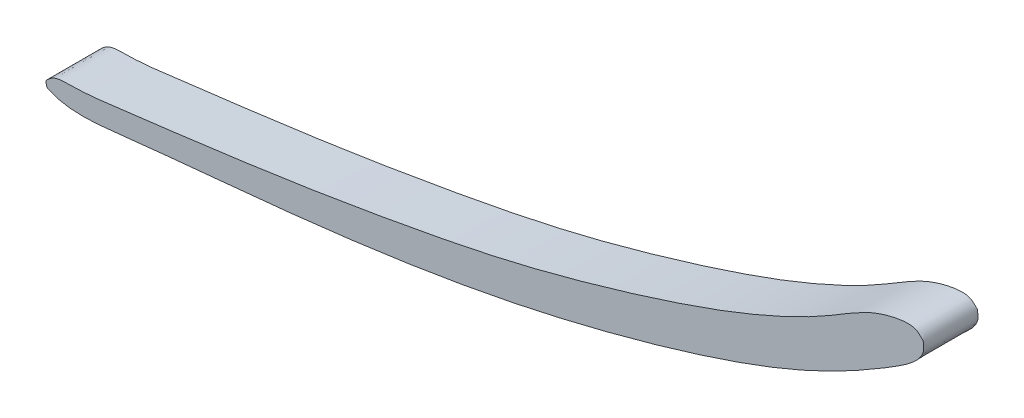
ISO-10303-21;
HEADER;
FILE_DESCRIPTION(('STEP AP214'),'2;1');
FILE_NAME('part.step','',(''),(''),'','','');
FILE_SCHEMA(('AUTOMOTIVE_DESIGN { 1 0 10303 214 1 1 1 1 }'));
ENDSEC;
DATA;
#1=APPLICATION_CONTEXT('core data for automotive mechanical design processes');
#2=APPLICATION_PROTOCOL_DEFINITION('international standard','automotive_design',2000,#1);
#3=PRODUCT_CONTEXT('',#1,'mechanical');
#4=PRODUCT('Part','Part','',(#3));
#5=PRODUCT_RELATED_PRODUCT_CATEGORY('part','',(#4));
#6=PRODUCT_DEFINITION_FORMATION('','',#4);
#7=PRODUCT_DEFINITION_CONTEXT('part definition',#1,'design');
#8=PRODUCT_DEFINITION('design','',#6,#7);
#9=PRODUCT_DEFINITION_SHAPE('','',#8);
#10=(LENGTH_UNIT() NAMED_UNIT(*) SI_UNIT(.MILLI.,.METRE.));
#11=(NAMED_UNIT(*) PLANE_ANGLE_UNIT() SI_UNIT($,.RADIAN.));
#12=(NAMED_UNIT(*) SI_UNIT($,.STERADIAN.) SOLID_ANGLE_UNIT());
#13=UNCERTAINTY_MEASURE_WITH_UNIT(LENGTH_MEASURE(1.E-05),#10,'distance_accuracy_value','');
#14=(GEOMETRIC_REPRESENTATION_CONTEXT(3) GLOBAL_UNCERTAINTY_ASSIGNED_CONTEXT((#13)) GLOBAL_UNIT_ASSIGNED_CONTEXT((#10,
#11,#12)) REPRESENTATION_CONTEXT('',''));
#15=CARTESIAN_POINT('',(0.,0.,0.));
#16=DIRECTION('',(0.,0.,1.));
#17=DIRECTION('',(1.,0.,0.));
#18=AXIS2_PLACEMENT_3D('',#15,#16,#17);
#19=CARTESIAN_POINT('',(77.0471824251004,0.,340.));
#20=CARTESIAN_POINT('',(77.0146555322056,0.0863166586013353,340.));
#21=CARTESIAN_POINT('',(76.9524964480641,0.154335533494201,340.));
#22=CARTESIAN_POINT('',(76.8237230305714,0.282837010887133,340.));
#23=CARTESIAN_POINT('',(76.7556264445835,0.343122665332197,340.));
#24=CARTESIAN_POINT('',(76.5553728382018,0.528293432071832,340.));
#25=CARTESIAN_POINT('',(76.4220917559369,0.653592764606201,340.));
#26=CARTESIAN_POINT('',(76.2043074000419,0.814460488594797,340.));
#27=CARTESIAN_POINT('',(76.1290725258105,0.86382796948944,340.));
#28=CARTESIAN_POINT('',(75.96939127876,0.94771654116557,340.));
#29=CARTESIAN_POINT('',(75.8844994922596,0.983024516410986,340.));
#30=CARTESIAN_POINT('',(75.6246037444075,1.06898672410137,340.));
#31=CARTESIAN_POINT('',(75.4466999622953,1.10009486170765,340.));
#32=CARTESIAN_POINT('',(75.0864322881535,1.13712662451366,340.));
#33=CARTESIAN_POINT('',(74.9037374390867,1.14218857214666,340.));
#34=CARTESIAN_POINT('',(74.5424142232882,1.13912913551873,340.));
#35=CARTESIAN_POINT('',(74.3626582437369,1.1303364467,340.));
#36=CARTESIAN_POINT('',(73.8257883448107,1.08472654872135,340.));
#37=CARTESIAN_POINT('',(73.4708334291705,1.03059453213553,340.));
#38=CARTESIAN_POINT('',(72.7637995287449,0.899266069698866,340.));
#39=CARTESIAN_POINT('',(72.4109138075771,0.820139550652951,340.));
#40=CARTESIAN_POINT('',(71.7133401259366,0.640473894826015,340.));
#41=CARTESIAN_POINT('',(71.3689605037362,0.540512570028266,340.));
#42=CARTESIAN_POINT('',(70.3483277394546,0.211887562048509,340.));
#43=CARTESIAN_POINT('',(69.6851033159787,-0.0467182109595835,340.));
#44=CARTESIAN_POINT('',(67.7447185778583,-0.935808500752684,340.));
#45=CARTESIAN_POINT('',(66.5113431371267,-1.6680403111967,340.));
#46=CARTESIAN_POINT('',(64.0536214073227,-3.14717577345884,340.));
#47=CARTESIAN_POINT('',(62.8234225107314,-3.88414230181726,340.));
#48=CARTESIAN_POINT('',(60.3142384271617,-5.26323228804384,340.));
#49=CARTESIAN_POINT('',(59.0379593899145,-5.91061664088238,340.));
#50=CARTESIAN_POINT('',(56.457464889384,-7.1510754901888,340.));
#51=CARTESIAN_POINT('',(55.1531990656894,-7.74405208341363,340.));
#52=CARTESIAN_POINT('',(52.5233662364128,-8.88859467112276,340.));
#53=CARTESIAN_POINT('',(51.1973467497779,-9.43830430356624,340.));
#54=CARTESIAN_POINT('',(48.530657853182,-10.4919328429382,340.));
#55=CARTESIAN_POINT('',(47.1894193599274,-10.9971700086824,340.));
#56=CARTESIAN_POINT('',(43.1474834055716,-12.4630787652045,340.));
#57=CARTESIAN_POINT('',(40.4288084726874,-13.3758096283422,340.));
#58=CARTESIAN_POINT('',(34.9654885667954,-15.1250049640294,340.));
#59=CARTESIAN_POINT('',(32.2199888554053,-15.9563645046367,340.));
#60=CARTESIAN_POINT('',(26.7093937571909,-17.5481608100868,340.));
#61=CARTESIAN_POINT('',(23.9445746865587,-18.3085100052458,340.));
#62=CARTESIAN_POINT('',(18.3882260762704,-19.7294838581142,340.));
#63=CARTESIAN_POINT('',(15.5957280661058,-20.3893578811587,340.));
#64=CARTESIAN_POINT('',(9.99129559669953,-21.6080539721866,340.));
#65=CARTESIAN_POINT('',(7.17927046386732,-22.1699851603401,340.));
#66=CARTESIAN_POINT('',(1.54356475054083,-23.2375043376461,340.));
#67=CARTESIAN_POINT('',(-1.2796953431305,-23.7442216498729,340.));
#68=CARTESIAN_POINT('',(-6.93171871570946,-24.7219311757435,340.));
#69=CARTESIAN_POINT('',(-9.76097830039444,-25.191796424645,340.));
#70=CARTESIAN_POINT('',(-15.4279124031103,-26.0822946924952,340.));
#71=CARTESIAN_POINT('',(-18.265080685828,-26.5016793423909,340.));
#72=CARTESIAN_POINT('',(-23.945273229535,-27.2995266241375,340.));
#73=CARTESIAN_POINT('',(-26.7882025273632,-27.6789489674857,340.));
#74=CARTESIAN_POINT('',(-32.4765710658541,-28.4186804039392,340.));
#75=CARTESIAN_POINT('',(-35.3215683118665,-28.78231857797,340.));
#76=CARTESIAN_POINT('',(-39.5900884189641,-29.3196074259457,340.));
#77=CARTESIAN_POINT('',(-41.0133511400201,-29.495315036399,340.));
#78=CARTESIAN_POINT('',(-43.8608217500198,-29.838968634286,340.));
#79=CARTESIAN_POINT('',(-45.285002612444,-30.0190210079599,340.));
#80=CARTESIAN_POINT('',(-47.0746167465888,-30.1217813882314,340.));
#81=CARTESIAN_POINT('',(-47.4327564283644,-30.1369148293064,340.));
#82=CARTESIAN_POINT('',(-48.1495646836194,-30.1539660983092,340.));
#83=CARTESIAN_POINT('',(-48.5083094982918,-30.1539788592691,340.));
#84=CARTESIAN_POINT('',(-49.2252625076823,-30.1674131030013,340.));
#85=CARTESIAN_POINT('',(-49.5840358391826,-30.1814765658246,340.));
#86=CARTESIAN_POINT('',(-50.2971441110804,-30.2572576264925,340.));
#87=CARTESIAN_POINT('',(-50.6490127319915,-30.3172343289797,340.));
#88=CARTESIAN_POINT('',(-51.1542180914164,-30.5137178465537,340.));
#89=CARTESIAN_POINT('',(-51.3113826366352,-30.5978341956615,340.));
#90=CARTESIAN_POINT('',(-51.6076182423445,-30.7919691396183,340.));
#91=CARTESIAN_POINT('',(-51.7463449054835,-30.9032799814332,340.));
#92=CARTESIAN_POINT('',(-51.9531584541602,-31.0721822065051,340.));
#93=CARTESIAN_POINT('',(-52.022182470908,-31.1292090866995,340.));
#94=CARTESIAN_POINT('',(-52.1487733284143,-31.2547196672732,340.));
#95=CARTESIAN_POINT('',(-52.2067031299198,-31.3266225564946,340.));
#96=CARTESIAN_POINT('',(-52.2568427549299,-31.4987475585804,340.));
#97=CARTESIAN_POINT('',(-52.2519652975137,-31.5901243448903,340.));
#98=CARTESIAN_POINT('',(-52.225836321639,-31.7648290498639,340.));
#99=CARTESIAN_POINT('',(-52.2064552932178,-31.8510930105967,340.));
#100=CARTESIAN_POINT('',(-52.1565899063423,-32.0217077371924,340.));
#101=CARTESIAN_POINT('',(-52.1249198310784,-32.1067611570869,340.));
#102=CARTESIAN_POINT('',(-52.0451983343292,-32.2123002935991,340.));
#103=CARTESIAN_POINT('',(-52.0131853247661,-32.244160940725,340.));
#104=CARTESIAN_POINT('',(-51.9414556778389,-32.2956635428167,340.));
#105=CARTESIAN_POINT('',(-51.9016471867821,-32.3155451361235,340.));
#106=CARTESIAN_POINT('',(-51.7783230470125,-32.3659175753124,340.));
#107=CARTESIAN_POINT('',(-51.6923979877279,-32.3884557118565,340.));
#108=CARTESIAN_POINT('',(-51.5231673904825,-32.4413316400593,340.));
#109=CARTESIAN_POINT('',(-51.4389528037406,-32.4689627284318,340.));
#110=CARTESIAN_POINT('',(-51.1879203450189,-32.5566536624601,340.));
#111=CARTESIAN_POINT('',(-51.0222339862843,-32.620865695218,340.));
#112=CARTESIAN_POINT('',(-50.6885784845226,-32.7407261607042,340.));
#113=CARTESIAN_POINT('',(-50.5205915138849,-32.79572561507,340.));
#114=CARTESIAN_POINT('',(-50.0106690590748,-32.9353663644461,340.));
#115=CARTESIAN_POINT('',(-49.6643869796551,-33.0015192773072,340.));
#116=CARTESIAN_POINT('',(-48.9652965778557,-33.1060655194977,340.));
#117=CARTESIAN_POINT('',(-48.6116792270687,-33.1454182767843,340.));
#118=CARTESIAN_POINT('',(-47.5546619711886,-33.2292997928266,340.));
#119=CARTESIAN_POINT('',(-46.8524943366603,-33.237922858829,340.));
#120=CARTESIAN_POINT('',(-45.4512826023249,-33.1963222867672,340.));
#121=CARTESIAN_POINT('',(-44.7521151770398,-33.1484220734604,340.));
#122=CARTESIAN_POINT('',(-43.3549261760107,-33.0310340946454,340.));
#123=CARTESIAN_POINT('',(-42.6569807078951,-32.9601124782319,340.));
#124=CARTESIAN_POINT('',(-40.5636218693402,-32.7383503949779,340.));
#125=CARTESIAN_POINT('',(-39.1687931225503,-32.5779330235232,340.));
#126=CARTESIAN_POINT('',(-36.3777584826631,-32.2738299813763,340.));
#127=CARTESIAN_POINT('',(-34.9815949952765,-32.1279594765328,340.));
#128=CARTESIAN_POINT('',(-30.7912858318226,-31.7077450350649,340.));
#129=CARTESIAN_POINT('',(-27.9958980075123,-31.4454823578545,340.));
#130=CARTESIAN_POINT('',(-22.4064884392869,-30.9077600312406,340.));
#131=CARTESIAN_POINT('',(-19.6125873324476,-30.6308927493038,340.));
#132=CARTESIAN_POINT('',(-14.0290194129763,-30.0349767490959,340.));
#133=CARTESIAN_POINT('',(-11.2392841390066,-29.7163798832265,340.));
#134=CARTESIAN_POINT('',(-5.66799810320546,-29.0211226705023,340.));
#135=CARTESIAN_POINT('',(-2.88617590834408,-28.64476183975,340.));
#136=CARTESIAN_POINT('',(5.44635399415661,-27.4183967335943,340.));
#137=CARTESIAN_POINT('',(10.9811645024912,-26.4664397070159,340.));
#138=CARTESIAN_POINT('',(19.2328397543524,-24.7834161335269,340.));
#139=CARTESIAN_POINT('',(21.975743131188,-24.1787582693961,340.));
#140=CARTESIAN_POINT('',(27.4391633385939,-22.8868987305506,340.));
#141=CARTESIAN_POINT('',(30.1605525025149,-22.1998604441367,340.));
#142=CARTESIAN_POINT('',(35.5840563575425,-20.7490132467417,340.));
#143=CARTESIAN_POINT('',(38.2864671245927,-19.9831264422487,340.));
#144=CARTESIAN_POINT('',(43.661690378912,-18.3649653233764,340.));
#145=CARTESIAN_POINT('',(46.3353036288615,-17.5128570425006,340.));
#146=CARTESIAN_POINT('',(51.6407805561876,-15.6803121072609,340.));
#147=CARTESIAN_POINT('',(54.2750173140796,-14.6987147480214,340.));
#148=CARTESIAN_POINT('',(59.4612276986311,-12.546674316923,340.));
#149=CARTESIAN_POINT('',(62.0162582767699,-11.3736221972291,340.));
#150=CARTESIAN_POINT('',(67.013837923782,-8.80951193411212,340.));
#151=CARTESIAN_POINT('',(69.4583616925774,-7.41981567579946,340.));
#152=CARTESIAN_POINT('',(72.4510876879843,-5.58224403511159,340.));
#153=CARTESIAN_POINT('',(73.0467075306561,-5.20967054019417,340.));
#154=CARTESIAN_POINT('',(73.9266370823077,-4.63027731878672,340.));
#155=CARTESIAN_POINT('',(74.2170880788137,-4.43304809487779,340.));
#156=CARTESIAN_POINT('',(74.7885298643328,-4.02502849642455,340.));
#157=CARTESIAN_POINT('',(75.070618625478,-3.81430838622695,340.));
#158=CARTESIAN_POINT('',(75.6114595386623,-3.36925027527479,340.));
#159=CARTESIAN_POINT('',(75.8704060250538,-3.1350594885547,340.));
#160=CARTESIAN_POINT('',(76.2296746466436,-2.75414516921807,340.));
#161=CARTESIAN_POINT('',(76.3444437070808,-2.62210497257768,340.));
#162=CARTESIAN_POINT('',(76.5605512403057,-2.34437421234657,340.));
#163=CARTESIAN_POINT('',(76.6619184754367,-2.19816225725901,340.));
#164=CARTESIAN_POINT('',(76.8447587316167,-1.89656094146917,340.));
#165=CARTESIAN_POINT('',(76.9268574595057,-1.74021782568998,340.));
#166=CARTESIAN_POINT('',(77.0573933826859,-1.40982604823507,340.));
#167=CARTESIAN_POINT('',(77.1047913583254,-1.24064638179016,340.));
#168=CARTESIAN_POINT('',(77.1348953502386,-0.887865191662483,340.));
#169=CARTESIAN_POINT('',(77.1147362753775,-0.708538757578463,340.));
#170=CARTESIAN_POINT('',(77.0900031531362,-0.442788745670691,340.));
#171=CARTESIAN_POINT('',(77.0857480509515,-0.353886186285419,340.));
#172=CARTESIAN_POINT('',(77.0790792907043,-0.175933714904456,340.));
#173=CARTESIAN_POINT('',(77.0797093179952,-0.08631665860132,340.));
#174=CARTESIAN_POINT('',(77.0471824251004,0.,340.));
#175=B_SPLINE_CURVE_WITH_KNOTS('',3,(#19,#20,#21,#22,#23,#24,#25,#26,#27,#28,#29,#30,#31,#32,
#33,#34,#35,#36,#37,#38,#39,#40,#41,#42,#43,#44,#45,#46,#47,#48,#49,#50,#51,#52,#53,#54,#55,#56,
#57,#58,#59,#60,#61,#62,#63,#64,#65,#66,#67,#68,#69,#70,#71,#72,#73,#74,#75,#76,#77,#78,#79,#80,
#81,#82,#83,#84,#85,#86,#87,#88,#89,#90,#91,#92,#93,#94,#95,#96,#97,#98,#99,#100,#101,#102,#103,
#104,#105,#106,#107,#108,#109,#110,#111,#112,#113,#114,#115,#116,#117,#118,#119,#120,#121,#122,
#123,#124,#125,#126,#127,#128,#129,#130,#131,#132,#133,#134,#135,#136,#137,#138,#139,#140,#141,
#142,#143,#144,#145,#146,#147,#148,#149,#150,#151,#152,#153,#154,#155,#156,#157,#158,#159,#160,
#161,#162,#163,#164,#165,#166,#167,#168,#169,#170,#171,#172,#173,#174),.UNSPECIFIED.,.T.,.F.,(4,
2,2,2,2,2,2,2,2,2,2,2,2,2,2,2,2,2,2,2,2,2,2,2,2,2,2,2,2,2,2,2,2,2,2,2,2,2,2,2,2,2,2,2,2,2,2,2,2,
2,2,2,2,2,2,2,2,2,2,2,2,2,2,2,2,2,2,2,2,2,2,2,2,2,2,2,2,4),(0.,0.000976562499999935,
0.00195312499999987,0.00390624999999985,0.00488281249999984,0.00585937499999983,
0.00781249999999981,0.00976562499999978,0.0117187499999998,0.0156249999999997,
0.0195312499999997,0.0234374999999996,0.0312499999999995,0.0468749999999992,0.0624999999999989,
0.0781249999999986,0.0937499999999983,0.109374999999998,0.124999999999998,0.156249999999997,
0.187499999999996,0.218749999999996,0.249999999999995,0.281249999999995,0.312499999999994,
0.343749999999993,0.374999999999993,0.406249999999992,0.437499999999991,0.453124999999991,
0.468749999999991,0.472656249999991,0.476562499999991,0.48046874999999,0.48437499999999,
0.48632812499999,0.48828124999999,0.48925781249999,0.49023437499999,0.49121093749999,
0.49218749999999,0.49316406249999,0.49365234374999,0.49414062499999,0.49511718749999,
0.49609374999999,0.49804687499999,0.49999999999999,0.50390624999999,0.50781249999999,
0.515624999999991,0.523437499999991,0.531249999999991,0.546874999999991,0.562499999999992,
0.593749999999992,0.624999999999993,0.656249999999993,0.687499999999994,0.749999999999995,
0.781249999999996,0.812499999999996,0.843749999999997,0.874999999999997,0.906249999999998,
0.937499999999999,0.968749999999999,0.976562499999999,0.980468749999999,0.984374999999999,
0.988281249999999,0.990234375,0.9921875,0.994140625,0.99609375,0.998046875,0.9990234375,1.),.UNSPECIFIED.);
#176=DIRECTION('',(0.,0.,-1.));
#177=VECTOR('',#176,1.);
#178=SURFACE_OF_LINEAR_EXTRUSION('',#175,#177);
#179=CARTESIAN_POINT('',(77.0471824251004,0.,340.));
#180=CARTESIAN_POINT('',(77.0797093179952,-0.08631665860132,340.));
#181=CARTESIAN_POINT('',(77.0790792907043,-0.175933714904456,340.));
#182=CARTESIAN_POINT('',(77.0857480509515,-0.353886186285419,340.));
#183=CARTESIAN_POINT('',(77.0900031531362,-0.442788745670691,340.));
#184=CARTESIAN_POINT('',(77.1147362753775,-0.708538757578463,340.));
#185=CARTESIAN_POINT('',(77.1348953502386,-0.887865191662483,340.));
#186=CARTESIAN_POINT('',(77.1047913583254,-1.24064638179016,340.));
#187=CARTESIAN_POINT('',(77.0573933826859,-1.40982604823507,340.));
#188=CARTESIAN_POINT('',(76.9268574595057,-1.74021782568998,340.));
#189=CARTESIAN_POINT('',(76.8447587316167,-1.89656094146917,340.));
#190=CARTESIAN_POINT('',(76.6619184754367,-2.19816225725901,340.));
#191=CARTESIAN_POINT('',(76.5605512403057,-2.34437421234657,340.));
#192=CARTESIAN_POINT('',(76.3444437070808,-2.62210497257768,340.));
#193=CARTESIAN_POINT('',(76.2296746466436,-2.75414516921807,340.));
#194=CARTESIAN_POINT('',(75.8704060250538,-3.1350594885547,340.));
#195=CARTESIAN_POINT('',(75.6114595386623,-3.36925027527479,340.));
#196=CARTESIAN_POINT('',(75.070618625478,-3.81430838622695,340.));
#197=CARTESIAN_POINT('',(74.7885298643328,-4.02502849642455,340.));
#198=CARTESIAN_POINT('',(74.2170880788137,-4.43304809487779,340.));
#199=CARTESIAN_POINT('',(73.9266370823077,-4.63027731878672,340.));
#200=CARTESIAN_POINT('',(73.0467075306561,-5.20967054019417,340.));
#201=CARTESIAN_POINT('',(72.4510876879843,-5.58224403511159,340.));
#202=CARTESIAN_POINT('',(69.4583616925774,-7.41981567579946,340.));
#203=CARTESIAN_POINT('',(67.013837923782,-8.80951193411212,340.));
#204=CARTESIAN_POINT('',(62.0162582767699,-11.3736221972291,340.));
#205=CARTESIAN_POINT('',(59.4612276986311,-12.546674316923,340.));
#206=CARTESIAN_POINT('',(54.2750173140796,-14.6987147480214,340.));
#207=CARTESIAN_POINT('',(51.6407805561876,-15.6803121072609,340.));
#208=CARTESIAN_POINT('',(46.3353036288615,-17.5128570425006,340.));
#209=CARTESIAN_POINT('',(43.661690378912,-18.3649653233764,340.));
#210=CARTESIAN_POINT('',(38.2864671245927,-19.9831264422487,340.));
#211=CARTESIAN_POINT('',(35.5840563575425,-20.7490132467417,340.));
#212=CARTESIAN_POINT('',(30.1605525025149,-22.1998604441367,340.));
#213=CARTESIAN_POINT('',(27.4391633385939,-22.8868987305506,340.));
#214=CARTESIAN_POINT('',(21.975743131188,-24.1787582693961,340.));
#215=CARTESIAN_POINT('',(19.2328397543524,-24.7834161335269,340.));
#216=CARTESIAN_POINT('',(10.9811645024912,-26.4664397070159,340.));
#217=CARTESIAN_POINT('',(5.44635399415661,-27.4183967335943,340.));
#218=CARTESIAN_POINT('',(-2.88617590834408,-28.64476183975,340.));
#219=CARTESIAN_POINT('',(-5.66799810320546,-29.0211226705023,340.));
#220=CARTESIAN_POINT('',(-11.2392841390066,-29.7163798832265,340.));
#221=CARTESIAN_POINT('',(-14.0290194129763,-30.0349767490959,340.));
#222=CARTESIAN_POINT('',(-19.6125873324476,-30.6308927493038,340.));
#223=CARTESIAN_POINT('',(-22.4064884392869,-30.9077600312406,340.));
#224=CARTESIAN_POINT('',(-27.9958980075123,-31.4454823578545,340.));
#225=CARTESIAN_POINT('',(-30.7912858318226,-31.7077450350649,340.));
#226=CARTESIAN_POINT('',(-34.9815949952765,-32.1279594765328,340.));
#227=CARTESIAN_POINT('',(-36.3777584826631,-32.2738299813763,340.));
#228=CARTESIAN_POINT('',(-39.1687931225503,-32.5779330235232,340.));
#229=CARTESIAN_POINT('',(-40.5636218693402,-32.7383503949779,340.));
#230=CARTESIAN_POINT('',(-42.6569807078951,-32.9601124782319,340.));
#231=CARTESIAN_POINT('',(-43.3549261760107,-33.0310340946454,340.));
#232=CARTESIAN_POINT('',(-44.7521151770398,-33.1484220734604,340.));
#233=CARTESIAN_POINT('',(-45.4512826023249,-33.1963222867672,340.));
#234=CARTESIAN_POINT('',(-46.8524943366603,-33.237922858829,340.));
#235=CARTESIAN_POINT('',(-47.5546619711886,-33.2292997928266,340.));
#236=CARTESIAN_POINT('',(-48.6116792270687,-33.1454182767843,340.));
#237=CARTESIAN_POINT('',(-48.9652965778557,-33.1060655194977,340.));
#238=CARTESIAN_POINT('',(-49.6643869796551,-33.0015192773072,340.));
#239=CARTESIAN_POINT('',(-50.0106690590748,-32.9353663644461,340.));
#240=CARTESIAN_POINT('',(-50.5205915138849,-32.79572561507,340.));
#241=CARTESIAN_POINT('',(-50.6885784845226,-32.7407261607042,340.));
#242=CARTESIAN_POINT('',(-51.0222339862843,-32.620865695218,340.));
#243=CARTESIAN_POINT('',(-51.1879203450189,-32.5566536624601,340.));
#244=CARTESIAN_POINT('',(-51.4389528037406,-32.4689627284318,340.));
#245=CARTESIAN_POINT('',(-51.5231673904825,-32.4413316400593,340.));
#246=CARTESIAN_POINT('',(-51.6923979877279,-32.3884557118565,340.));
#247=CARTESIAN_POINT('',(-51.7783230470125,-32.3659175753124,340.));
#248=CARTESIAN_POINT('',(-51.9016471867821,-32.3155451361235,340.));
#249=CARTESIAN_POINT('',(-51.9414556778389,-32.2956635428167,340.));
#250=CARTESIAN_POINT('',(-52.0131853247661,-32.244160940725,340.));
#251=CARTESIAN_POINT('',(-52.0451983343292,-32.2123002935991,340.));
#252=CARTESIAN_POINT('',(-52.1249198310784,-32.1067611570869,340.));
#253=CARTESIAN_POINT('',(-52.1565899063423,-32.0217077371924,340.));
#254=CARTESIAN_POINT('',(-52.2064552932178,-31.8510930105967,340.));
#255=CARTESIAN_POINT('',(-52.225836321639,-31.7648290498639,340.));
#256=CARTESIAN_POINT('',(-52.2519652975137,-31.5901243448903,340.));
#257=CARTESIAN_POINT('',(-52.2568427549299,-31.4987475585804,340.));
#258=CARTESIAN_POINT('',(-52.2067031299198,-31.3266225564946,340.));
#259=CARTESIAN_POINT('',(-52.1487733284143,-31.2547196672732,340.));
#260=CARTESIAN_POINT('',(-52.022182470908,-31.1292090866995,340.));
#261=CARTESIAN_POINT('',(-51.9531584541602,-31.0721822065051,340.));
#262=CARTESIAN_POINT('',(-51.7463449054835,-30.9032799814332,340.));
#263=CARTESIAN_POINT('',(-51.6076182423445,-30.7919691396183,340.));
#264=CARTESIAN_POINT('',(-51.3113826366352,-30.5978341956615,340.));
#265=CARTESIAN_POINT('',(-51.1542180914164,-30.5137178465537,340.));
#266=CARTESIAN_POINT('',(-50.6490127319915,-30.3172343289797,340.));
#267=CARTESIAN_POINT('',(-50.2971441110804,-30.2572576264925,340.));
#268=CARTESIAN_POINT('',(-49.5840358391826,-30.1814765658246,340.));
#269=CARTESIAN_POINT('',(-49.2252625076823,-30.1674131030013,340.));
#270=CARTESIAN_POINT('',(-48.5083094982918,-30.1539788592691,340.));
#271=CARTESIAN_POINT('',(-48.1495646836194,-30.1539660983092,340.));
#272=CARTESIAN_POINT('',(-47.4327564283644,-30.1369148293064,340.));
#273=CARTESIAN_POINT('',(-47.0746167465888,-30.1217813882314,340.));
#274=CARTESIAN_POINT('',(-45.285002612444,-30.0190210079599,340.));
#275=CARTESIAN_POINT('',(-43.8608217500198,-29.838968634286,340.));
#276=CARTESIAN_POINT('',(-41.0133511400201,-29.495315036399,340.));
#277=CARTESIAN_POINT('',(-39.5900884189641,-29.3196074259457,340.));
#278=CARTESIAN_POINT('',(-35.3215683118665,-28.78231857797,340.));
#279=CARTESIAN_POINT('',(-32.4765710658541,-28.4186804039392,340.));
#280=CARTESIAN_POINT('',(-26.7882025273632,-27.6789489674857,340.));
#281=CARTESIAN_POINT('',(-23.945273229535,-27.2995266241375,340.));
#282=CARTESIAN_POINT('',(-18.265080685828,-26.5016793423909,340.));
#283=CARTESIAN_POINT('',(-15.4279124031103,-26.0822946924952,340.));
#284=CARTESIAN_POINT('',(-9.76097830039444,-25.191796424645,340.));
#285=CARTESIAN_POINT('',(-6.93171871570946,-24.7219311757435,340.));
#286=CARTESIAN_POINT('',(-1.2796953431305,-23.7442216498729,340.));
#287=CARTESIAN_POINT('',(1.54356475054083,-23.2375043376461,340.));
#288=CARTESIAN_POINT('',(7.17927046386732,-22.1699851603401,340.));
#289=CARTESIAN_POINT('',(9.99129559669953,-21.6080539721866,340.));
#290=CARTESIAN_POINT('',(15.5957280661058,-20.3893578811587,340.));
#291=CARTESIAN_POINT('',(18.3882260762704,-19.7294838581142,340.));
#292=CARTESIAN_POINT('',(23.9445746865587,-18.3085100052458,340.));
#293=CARTESIAN_POINT('',(26.7093937571909,-17.5481608100868,340.));
#294=CARTESIAN_POINT('',(32.2199888554053,-15.9563645046367,340.));
#295=CARTESIAN_POINT('',(34.9654885667954,-15.1250049640294,340.));
#296=CARTESIAN_POINT('',(40.4288084726874,-13.3758096283422,340.));
#297=CARTESIAN_POINT('',(43.1474834055716,-12.4630787652045,340.));
#298=CARTESIAN_POINT('',(47.1894193599274,-10.9971700086824,340.));
#299=CARTESIAN_POINT('',(48.530657853182,-10.4919328429382,340.));
#300=CARTESIAN_POINT('',(51.1973467497779,-9.43830430356624,340.));
#301=CARTESIAN_POINT('',(52.5233662364128,-8.88859467112276,340.));
#302=CARTESIAN_POINT('',(55.1531990656894,-7.74405208341363,340.));
#303=CARTESIAN_POINT('',(56.457464889384,-7.1510754901888,340.));
#304=CARTESIAN_POINT('',(59.0379593899145,-5.91061664088238,340.));
#305=CARTESIAN_POINT('',(60.3142384271617,-5.26323228804384,340.));
#306=CARTESIAN_POINT('',(62.8234225107314,-3.88414230181726,340.));
#307=CARTESIAN_POINT('',(64.0536214073227,-3.14717577345884,340.));
#308=CARTESIAN_POINT('',(66.5113431371267,-1.6680403111967,340.));
#309=CARTESIAN_POINT('',(67.7447185778583,-0.935808500752684,340.));
#310=CARTESIAN_POINT('',(69.6851033159787,-0.0467182109595835,340.));
#311=CARTESIAN_POINT('',(70.3483277394546,0.211887562048509,340.));
#312=CARTESIAN_POINT('',(71.3689605037362,0.540512570028266,340.));
#313=CARTESIAN_POINT('',(71.7133401259366,0.640473894826015,340.));
#314=CARTESIAN_POINT('',(72.4109138075771,0.820139550652951,340.));
#315=CARTESIAN_POINT('',(72.7637995287449,0.899266069698866,340.));
#316=CARTESIAN_POINT('',(73.4708334291705,1.03059453213553,340.));
#317=CARTESIAN_POINT('',(73.8257883448107,1.08472654872135,340.));
#318=CARTESIAN_POINT('',(74.3626582437369,1.1303364467,340.));
#319=CARTESIAN_POINT('',(74.5424142232882,1.13912913551873,340.));
#320=CARTESIAN_POINT('',(74.9037374390867,1.14218857214666,340.));
#321=CARTESIAN_POINT('',(75.0864322881535,1.13712662451366,340.));
#322=CARTESIAN_POINT('',(75.4466999622953,1.10009486170765,340.));
#323=CARTESIAN_POINT('',(75.6246037444075,1.06898672410137,340.));
#324=CARTESIAN_POINT('',(75.8844994922596,0.983024516410986,340.));
#325=CARTESIAN_POINT('',(75.96939127876,0.94771654116557,340.));
#326=CARTESIAN_POINT('',(76.1290725258105,0.86382796948944,340.));
#327=CARTESIAN_POINT('',(76.2043074000419,0.814460488594797,340.));
#328=CARTESIAN_POINT('',(76.4220917559369,0.653592764606201,340.));
#329=CARTESIAN_POINT('',(76.5553728382018,0.528293432071832,340.));
#330=CARTESIAN_POINT('',(76.7556264445835,0.343122665332197,340.));
#331=CARTESIAN_POINT('',(76.8237230305714,0.282837010887133,340.));
#332=CARTESIAN_POINT('',(76.9524964480641,0.154335533494201,340.));
#333=CARTESIAN_POINT('',(77.0146555322056,0.0863166586013353,340.));
#334=CARTESIAN_POINT('',(77.0471824251004,0.,340.));
#335=B_SPLINE_CURVE_WITH_KNOTS('',3,(#179,#180,#181,#182,#183,#184,#185,#186,#187,#188,#189,
#190,#191,#192,#193,#194,#195,#196,#197,#198,#199,#200,#201,#202,#203,#204,#205,#206,#207,#208,
#209,#210,#211,#212,#213,#214,#215,#216,#217,#218,#219,#220,#221,#222,#223,#224,#225,#226,#227,
#228,#229,#230,#231,#232,#233,#234,#235,#236,#237,#238,#239,#240,#241,#242,#243,#244,#245,#246,
#247,#248,#249,#250,#251,#252,#253,#254,#255,#256,#257,#258,#259,#260,#261,#262,#263,#264,#265,
#266,#267,#268,#269,#270,#271,#272,#273,#274,#275,#276,#277,#278,#279,#280,#281,#282,#283,#284,
#285,#286,#287,#288,#289,#290,#291,#292,#293,#294,#295,#296,#297,#298,#299,#300,#301,#302,#303,
#304,#305,#306,#307,#308,#309,#310,#311,#312,#313,#314,#315,#316,#317,#318,#319,#320,#321,#322,
#323,#324,#325,#326,#327,#328,#329,#330,#331,#332,#333,#334),.UNSPECIFIED.,.T.,.F.,(4,2,2,2,2,2,
2,2,2,2,2,2,2,2,2,2,2,2,2,2,2,2,2,2,2,2,2,2,2,2,2,2,2,2,2,2,2,2,2,2,2,2,2,2,2,2,2,2,2,2,2,2,2,2,
2,2,2,2,2,2,2,2,2,2,2,2,2,2,2,2,2,2,2,2,2,2,2,4),(0.,0.0009765625,0.00195312500000011,
0.00390625000000022,0.00585937500000022,0.00781250000000033,0.00976562500000044,
0.0117187500000006,0.0156250000000007,0.0195312500000007,0.0234375000000008,0.0312500000000008,
0.0625000000000014,0.093750000000002,0.125000000000003,0.156250000000003,0.187500000000004,
0.218750000000004,0.250000000000005,0.312500000000006,0.343750000000007,0.375000000000007,
0.406250000000008,0.437500000000008,0.453125000000009,0.468750000000009,0.476562500000009,
0.484375000000009,0.49218750000001,0.49609375000001,0.50000000000001,0.50195312500001,
0.50390625000001,0.50488281250001,0.50585937500001,0.50634765625001,0.50683593750001,
0.50781250000001,0.50878906250001,0.50976562500001,0.51074218750001,0.51171875000001,
0.51367187500001,0.51562500000001,0.51953125000001,0.52343750000001,0.527343750000009,
0.531250000000009,0.546875000000009,0.562500000000009,0.593750000000008,0.625000000000007,
0.656250000000007,0.687500000000006,0.718750000000006,0.750000000000005,0.781250000000004,
0.812500000000004,0.843750000000003,0.875000000000002,0.890625000000002,0.906250000000002,
0.921875000000001,0.937500000000001,0.953125000000001,0.96875,0.9765625,0.98046875,0.984375,
0.98828125,0.990234375,0.9921875,0.994140625,0.9951171875,0.99609375,0.998046875,0.9990234375,
1.),.UNSPECIFIED.);
#336=CARTESIAN_POINT('',(77.0471824251004,0.,340.));
#337=VERTEX_POINT('',#336);
#338=EDGE_CURVE('E10',#337,#337,#335,.F.);
#339=ORIENTED_EDGE('',*,*,#338,.F.);
#340=EDGE_LOOP('',(#339));
#341=FACE_BOUND('',#340,.T.);
#342=CARTESIAN_POINT('',(77.0471824251004,0.,332.));
#343=CARTESIAN_POINT('',(77.0146555322056,0.0863166586013353,332.));
#344=CARTESIAN_POINT('',(76.9524964480641,0.154335533494201,332.));
#345=CARTESIAN_POINT('',(76.8237230305714,0.282837010887133,332.));
#346=CARTESIAN_POINT('',(76.7556264445835,0.343122665332197,332.));
#347=CARTESIAN_POINT('',(76.5553728382018,0.528293432071832,332.));
#348=CARTESIAN_POINT('',(76.4220917559369,0.653592764606201,332.));
#349=CARTESIAN_POINT('',(76.2043074000419,0.814460488594797,332.));
#350=CARTESIAN_POINT('',(76.1290725258105,0.86382796948944,332.));
#351=CARTESIAN_POINT('',(75.96939127876,0.94771654116557,332.));
#352=CARTESIAN_POINT('',(75.8844994922596,0.983024516410986,332.));
#353=CARTESIAN_POINT('',(75.6246037444075,1.06898672410137,332.));
#354=CARTESIAN_POINT('',(75.4466999622953,1.10009486170765,332.));
#355=CARTESIAN_POINT('',(75.0864322881535,1.13712662451366,332.));
#356=CARTESIAN_POINT('',(74.9037374390867,1.14218857214666,332.));
#357=CARTESIAN_POINT('',(74.5424142232882,1.13912913551873,332.));
#358=CARTESIAN_POINT('',(74.3626582437369,1.1303364467,332.));
#359=CARTESIAN_POINT('',(73.8257883448107,1.08472654872135,332.));
#360=CARTESIAN_POINT('',(73.4708334291705,1.03059453213553,332.));
#361=CARTESIAN_POINT('',(72.7637995287449,0.899266069698866,332.));
#362=CARTESIAN_POINT('',(72.4109138075771,0.820139550652951,332.));
#363=CARTESIAN_POINT('',(71.7133401259366,0.640473894826015,332.));
#364=CARTESIAN_POINT('',(71.3689605037362,0.540512570028266,332.));
#365=CARTESIAN_POINT('',(70.3483277394546,0.211887562048509,332.));
#366=CARTESIAN_POINT('',(69.6851033159787,-0.0467182109595835,332.));
#367=CARTESIAN_POINT('',(67.7447185778583,-0.935808500752684,332.));
#368=CARTESIAN_POINT('',(66.5113431371267,-1.6680403111967,332.));
#369=CARTESIAN_POINT('',(64.0536214073227,-3.14717577345884,332.));
#370=CARTESIAN_POINT('',(62.8234225107314,-3.88414230181726,332.));
#371=CARTESIAN_POINT('',(60.3142384271617,-5.26323228804384,332.));
#372=CARTESIAN_POINT('',(59.0379593899145,-5.91061664088238,332.));
#373=CARTESIAN_POINT('',(56.457464889384,-7.1510754901888,332.));
#374=CARTESIAN_POINT('',(55.1531990656894,-7.74405208341363,332.));
#375=CARTESIAN_POINT('',(52.5233662364128,-8.88859467112276,332.));
#376=CARTESIAN_POINT('',(51.1973467497779,-9.43830430356624,332.));
#377=CARTESIAN_POINT('',(48.530657853182,-10.4919328429382,332.));
#378=CARTESIAN_POINT('',(47.1894193599274,-10.9971700086824,332.));
#379=CARTESIAN_POINT('',(43.1474834055716,-12.4630787652045,332.));
#380=CARTESIAN_POINT('',(40.4288084726874,-13.3758096283422,332.));
#381=CARTESIAN_POINT('',(34.9654885667954,-15.1250049640294,332.));
#382=CARTESIAN_POINT('',(32.2199888554053,-15.9563645046367,332.));
#383=CARTESIAN_POINT('',(26.7093937571909,-17.5481608100868,332.));
#384=CARTESIAN_POINT('',(23.9445746865587,-18.3085100052458,332.));
#385=CARTESIAN_POINT('',(18.3882260762704,-19.7294838581142,332.));
#386=CARTESIAN_POINT('',(15.5957280661058,-20.3893578811587,332.));
#387=CARTESIAN_POINT('',(9.99129559669953,-21.6080539721866,332.));
#388=CARTESIAN_POINT('',(7.17927046386732,-22.1699851603401,332.));
#389=CARTESIAN_POINT('',(1.54356475054083,-23.2375043376461,332.));
#390=CARTESIAN_POINT('',(-1.2796953431305,-23.7442216498729,332.));
#391=CARTESIAN_POINT('',(-6.93171871570946,-24.7219311757435,332.));
#392=CARTESIAN_POINT('',(-9.76097830039444,-25.191796424645,332.));
#393=CARTESIAN_POINT('',(-15.4279124031103,-26.0822946924952,332.));
#394=CARTESIAN_POINT('',(-18.265080685828,-26.5016793423909,332.));
#395=CARTESIAN_POINT('',(-23.945273229535,-27.2995266241375,332.));
#396=CARTESIAN_POINT('',(-26.7882025273632,-27.6789489674857,332.));
#397=CARTESIAN_POINT('',(-32.4765710658541,-28.4186804039392,332.));
#398=CARTESIAN_POINT('',(-35.3215683118665,-28.78231857797,332.));
#399=CARTESIAN_POINT('',(-39.5900884189641,-29.3196074259457,332.));
#400=CARTESIAN_POINT('',(-41.0133511400201,-29.495315036399,332.));
#401=CARTESIAN_POINT('',(-43.8608217500198,-29.838968634286,332.));
#402=CARTESIAN_POINT('',(-45.285002612444,-30.0190210079599,332.));
#403=CARTESIAN_POINT('',(-47.0746167465888,-30.1217813882314,332.));
#404=CARTESIAN_POINT('',(-47.4327564283644,-30.1369148293064,332.));
#405=CARTESIAN_POINT('',(-48.1495646836194,-30.1539660983092,332.));
#406=CARTESIAN_POINT('',(-48.5083094982918,-30.1539788592691,332.));
#407=CARTESIAN_POINT('',(-49.2252625076823,-30.1674131030013,332.));
#408=CARTESIAN_POINT('',(-49.5840358391826,-30.1814765658246,332.));
#409=CARTESIAN_POINT('',(-50.2971441110804,-30.2572576264925,332.));
#410=CARTESIAN_POINT('',(-50.6490127319915,-30.3172343289797,332.));
#411=CARTESIAN_POINT('',(-51.1542180914164,-30.5137178465537,332.));
#412=CARTESIAN_POINT('',(-51.3113826366352,-30.5978341956615,332.));
#413=CARTESIAN_POINT('',(-51.6076182423445,-30.7919691396183,332.));
#414=CARTESIAN_POINT('',(-51.7463449054835,-30.9032799814332,332.));
#415=CARTESIAN_POINT('',(-51.9531584541602,-31.0721822065051,332.));
#416=CARTESIAN_POINT('',(-52.022182470908,-31.1292090866995,332.));
#417=CARTESIAN_POINT('',(-52.1487733284143,-31.2547196672732,332.));
#418=CARTESIAN_POINT('',(-52.2067031299198,-31.3266225564946,332.));
#419=CARTESIAN_POINT('',(-52.2568427549299,-31.4987475585804,332.));
#420=CARTESIAN_POINT('',(-52.2519652975137,-31.5901243448903,332.));
#421=CARTESIAN_POINT('',(-52.225836321639,-31.7648290498639,332.));
#422=CARTESIAN_POINT('',(-52.2064552932178,-31.8510930105967,332.));
#423=CARTESIAN_POINT('',(-52.1565899063423,-32.0217077371924,332.));
#424=CARTESIAN_POINT('',(-52.1249198310784,-32.1067611570869,332.));
#425=CARTESIAN_POINT('',(-52.0451983343292,-32.2123002935991,332.));
#426=CARTESIAN_POINT('',(-52.0131853247661,-32.244160940725,332.));
#427=CARTESIAN_POINT('',(-51.9414556778389,-32.2956635428167,332.));
#428=CARTESIAN_POINT('',(-51.9016471867821,-32.3155451361235,332.));
#429=CARTESIAN_POINT('',(-51.7783230470125,-32.3659175753124,332.));
#430=CARTESIAN_POINT('',(-51.6923979877279,-32.3884557118565,332.));
#431=CARTESIAN_POINT('',(-51.5231673904825,-32.4413316400593,332.));
#432=CARTESIAN_POINT('',(-51.4389528037406,-32.4689627284318,332.));
#433=CARTESIAN_POINT('',(-51.1879203450189,-32.5566536624601,332.));
#434=CARTESIAN_POINT('',(-51.0222339862843,-32.620865695218,332.));
#435=CARTESIAN_POINT('',(-50.6885784845226,-32.7407261607042,332.));
#436=CARTESIAN_POINT('',(-50.5205915138849,-32.79572561507,332.));
#437=CARTESIAN_POINT('',(-50.0106690590748,-32.9353663644461,332.));
#438=CARTESIAN_POINT('',(-49.6643869796551,-33.0015192773072,332.));
#439=CARTESIAN_POINT('',(-48.9652965778557,-33.1060655194977,332.));
#440=CARTESIAN_POINT('',(-48.6116792270687,-33.1454182767843,332.));
#441=CARTESIAN_POINT('',(-47.5546619711886,-33.2292997928266,332.));
#442=CARTESIAN_POINT('',(-46.8524943366603,-33.237922858829,332.));
#443=CARTESIAN_POINT('',(-45.4512826023249,-33.1963222867672,332.));
#444=CARTESIAN_POINT('',(-44.7521151770398,-33.1484220734604,332.));
#445=CARTESIAN_POINT('',(-43.3549261760107,-33.0310340946454,332.));
#446=CARTESIAN_POINT('',(-42.6569807078951,-32.9601124782319,332.));
#447=CARTESIAN_POINT('',(-40.5636218693402,-32.7383503949779,332.));
#448=CARTESIAN_POINT('',(-39.1687931225503,-32.5779330235232,332.));
#449=CARTESIAN_POINT('',(-36.3777584826631,-32.2738299813763,332.));
#450=CARTESIAN_POINT('',(-34.9815949952765,-32.1279594765328,332.));
#451=CARTESIAN_POINT('',(-30.7912858318226,-31.7077450350649,332.));
#452=CARTESIAN_POINT('',(-27.9958980075123,-31.4454823578545,332.));
#453=CARTESIAN_POINT('',(-22.4064884392869,-30.9077600312406,332.));
#454=CARTESIAN_POINT('',(-19.6125873324476,-30.6308927493038,332.));
#455=CARTESIAN_POINT('',(-14.0290194129763,-30.0349767490959,332.));
#456=CARTESIAN_POINT('',(-11.2392841390066,-29.7163798832265,332.));
#457=CARTESIAN_POINT('',(-5.66799810320546,-29.0211226705023,332.));
#458=CARTESIAN_POINT('',(-2.88617590834408,-28.64476183975,332.));
#459=CARTESIAN_POINT('',(5.44635399415661,-27.4183967335943,332.));
#460=CARTESIAN_POINT('',(10.9811645024912,-26.4664397070159,332.));
#461=CARTESIAN_POINT('',(19.2328397543524,-24.7834161335269,332.));
#462=CARTESIAN_POINT('',(21.975743131188,-24.1787582693961,332.));
#463=CARTESIAN_POINT('',(27.4391633385939,-22.8868987305506,332.));
#464=CARTESIAN_POINT('',(30.1605525025149,-22.1998604441367,332.));
#465=CARTESIAN_POINT('',(35.5840563575425,-20.7490132467417,332.));
#466=CARTESIAN_POINT('',(38.2864671245927,-19.9831264422487,332.));
#467=CARTESIAN_POINT('',(43.661690378912,-18.3649653233764,332.));
#468=CARTESIAN_POINT('',(46.3353036288615,-17.5128570425006,332.));
#469=CARTESIAN_POINT('',(51.6407805561876,-15.6803121072609,332.));
#470=CARTESIAN_POINT('',(54.2750173140796,-14.6987147480214,332.));
#471=CARTESIAN_POINT('',(59.4612276986311,-12.546674316923,332.));
#472=CARTESIAN_POINT('',(62.0162582767699,-11.3736221972291,332.));
#473=CARTESIAN_POINT('',(67.013837923782,-8.80951193411212,332.));
#474=CARTESIAN_POINT('',(69.4583616925774,-7.41981567579946,332.));
#475=CARTESIAN_POINT('',(72.4510876879843,-5.58224403511159,332.));
#476=CARTESIAN_POINT('',(73.0467075306561,-5.20967054019417,332.));
#477=CARTESIAN_POINT('',(73.9266370823077,-4.63027731878672,332.));
#478=CARTESIAN_POINT('',(74.2170880788137,-4.43304809487779,332.));
#479=CARTESIAN_POINT('',(74.7885298643328,-4.02502849642455,332.));
#480=CARTESIAN_POINT('',(75.070618625478,-3.81430838622695,332.));
#481=CARTESIAN_POINT('',(75.6114595386623,-3.36925027527479,332.));
#482=CARTESIAN_POINT('',(75.8704060250538,-3.1350594885547,332.));
#483=CARTESIAN_POINT('',(76.2296746466436,-2.75414516921807,332.));
#484=CARTESIAN_POINT('',(76.3444437070808,-2.62210497257768,332.));
#485=CARTESIAN_POINT('',(76.5605512403057,-2.34437421234657,332.));
#486=CARTESIAN_POINT('',(76.6619184754367,-2.19816225725901,332.));
#487=CARTESIAN_POINT('',(76.8447587316167,-1.89656094146917,332.));
#488=CARTESIAN_POINT('',(76.9268574595057,-1.74021782568998,332.));
#489=CARTESIAN_POINT('',(77.0573933826859,-1.40982604823507,332.));
#490=CARTESIAN_POINT('',(77.1047913583254,-1.24064638179016,332.));
#491=CARTESIAN_POINT('',(77.1348953502386,-0.887865191662483,332.));
#492=CARTESIAN_POINT('',(77.1147362753775,-0.708538757578463,332.));
#493=CARTESIAN_POINT('',(77.0900031531362,-0.442788745670691,332.));
#494=CARTESIAN_POINT('',(77.0857480509515,-0.353886186285419,332.));
#495=CARTESIAN_POINT('',(77.0790792907043,-0.175933714904456,332.));
#496=CARTESIAN_POINT('',(77.0797093179952,-0.08631665860132,332.));
#497=CARTESIAN_POINT('',(77.0471824251004,0.,332.));
#498=B_SPLINE_CURVE_WITH_KNOTS('',3,(#342,#343,#344,#345,#346,#347,#348,#349,#350,#351,#352,
#353,#354,#355,#356,#357,#358,#359,#360,#361,#362,#363,#364,#365,#366,#367,#368,#369,#370,#371,
#372,#373,#374,#375,#376,#377,#378,#379,#380,#381,#382,#383,#384,#385,#386,#387,#388,#389,#390,
#391,#392,#393,#394,#395,#396,#397,#398,#399,#400,#401,#402,#403,#404,#405,#406,#407,#408,#409,
#410,#411,#412,#413,#414,#415,#416,#417,#418,#419,#420,#421,#422,#423,#424,#425,#426,#427,#428,
#429,#430,#431,#432,#433,#434,#435,#436,#437,#438,#439,#440,#441,#442,#443,#444,#445,#446,#447,
#448,#449,#450,#451,#452,#453,#454,#455,#456,#457,#458,#459,#460,#461,#462,#463,#464,#465,#466,
#467,#468,#469,#470,#471,#472,#473,#474,#475,#476,#477,#478,#479,#480,#481,#482,#483,#484,#485,
#486,#487,#488,#489,#490,#491,#492,#493,#494,#495,#496,#497),.UNSPECIFIED.,.T.,.F.,(4,2,2,2,2,2,
2,2,2,2,2,2,2,2,2,2,2,2,2,2,2,2,2,2,2,2,2,2,2,2,2,2,2,2,2,2,2,2,2,2,2,2,2,2,2,2,2,2,2,2,2,2,2,2,
2,2,2,2,2,2,2,2,2,2,2,2,2,2,2,2,2,2,2,2,2,2,2,4),(0.,0.000976562499999935,0.00195312499999987,
0.00390624999999985,0.00488281249999984,0.00585937499999983,0.00781249999999981,
0.00976562499999978,0.0117187499999998,0.0156249999999997,0.0195312499999997,0.0234374999999996,
0.0312499999999995,0.0468749999999992,0.0624999999999989,0.0781249999999986,0.0937499999999983,
0.109374999999998,0.124999999999998,0.156249999999997,0.187499999999996,0.218749999999996,
0.249999999999995,0.281249999999995,0.312499999999994,0.343749999999993,0.374999999999993,
0.406249999999992,0.437499999999991,0.453124999999991,0.468749999999991,0.472656249999991,
0.476562499999991,0.48046874999999,0.48437499999999,0.48632812499999,0.48828124999999,
0.48925781249999,0.49023437499999,0.49121093749999,0.49218749999999,0.49316406249999,
0.49365234374999,0.49414062499999,0.49511718749999,0.49609374999999,0.49804687499999,
0.49999999999999,0.50390624999999,0.50781249999999,0.515624999999991,0.523437499999991,
0.531249999999991,0.546874999999991,0.562499999999992,0.593749999999992,0.624999999999993,
0.656249999999993,0.687499999999994,0.749999999999995,0.781249999999996,0.812499999999996,
0.843749999999997,0.874999999999997,0.906249999999998,0.937499999999999,0.968749999999999,
0.976562499999999,0.980468749999999,0.984374999999999,0.988281249999999,0.990234375,0.9921875,
0.994140625,0.99609375,0.998046875,0.9990234375,1.),.UNSPECIFIED.);
#499=CARTESIAN_POINT('',(77.0471824251004,0.,332.));
#500=VERTEX_POINT('',#499);
#501=EDGE_CURVE('E38',#500,#500,#498,.T.);
#502=ORIENTED_EDGE('',*,*,#501,.T.);
#503=EDGE_LOOP('',(#502));
#504=FACE_BOUND('',#503,.T.);
#505=ADVANCED_FACE('F28',(#341,#504),#178,.F.);
#506=CARTESIAN_POINT('',(-50.350617362279,-32.8422725315294,340.));
#507=DIRECTION('',(0.,0.,-1.));
#508=DIRECTION('',(-1.,0.,0.));
#509=AXIS2_PLACEMENT_3D('',#506,#507,#508);
#510=PLANE('',#509);
#511=ORIENTED_EDGE('',*,*,#338,.T.);
#512=EDGE_LOOP('',(#511));
#513=FACE_BOUND('',#512,.T.);
#514=ADVANCED_FACE('F69',(#513),#510,.F.);
#515=CARTESIAN_POINT('',(-50.350617362279,-32.8422725315294,332.));
#516=DIRECTION('',(0.,0.,-1.));
#517=DIRECTION('',(-1.,0.,0.));
#518=AXIS2_PLACEMENT_3D('',#515,#516,#517);
#519=PLANE('',#518);
#520=ORIENTED_EDGE('',*,*,#501,.F.);
#521=EDGE_LOOP('',(#520));
#522=FACE_BOUND('',#521,.T.);
#523=ADVANCED_FACE('F77',(#522),#519,.T.);
#524=CLOSED_SHELL('',(#505,#514,#523));
#525=MANIFOLD_SOLID_BREP('B2',#524);
#526=ADVANCED_BREP_SHAPE_REPRESENTATION('',(#18,#525),#14);
#527=SHAPE_DEFINITION_REPRESENTATION(#9,#526);
ENDSEC;
END-ISO-10303-21;
